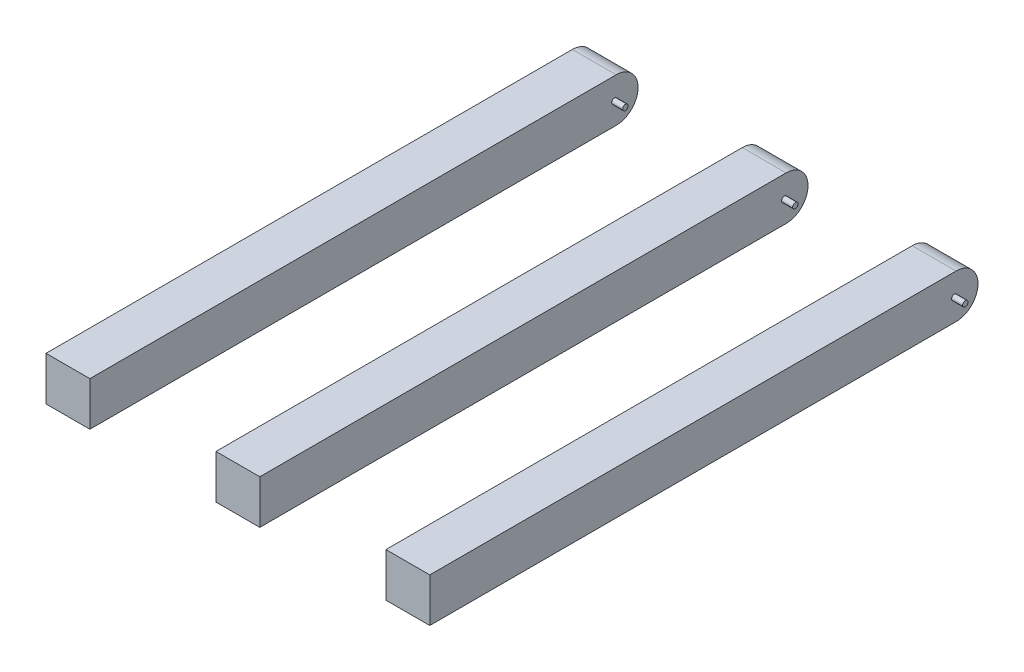
ISO-10303-21;
HEADER;
FILE_DESCRIPTION(('STEP AP214'),'2;1');
FILE_NAME('part.step','',(''),(''),'','','');
FILE_SCHEMA(('AUTOMOTIVE_DESIGN { 1 0 10303 214 1 1 1 1 }'));
ENDSEC;
DATA;
#1=APPLICATION_CONTEXT('core data for automotive mechanical design processes');
#2=APPLICATION_PROTOCOL_DEFINITION('international standard','automotive_design',2000,#1);
#3=PRODUCT_CONTEXT('',#1,'mechanical');
#4=PRODUCT('Part','Part','',(#3));
#5=PRODUCT_RELATED_PRODUCT_CATEGORY('part','',(#4));
#6=PRODUCT_DEFINITION_FORMATION('','',#4);
#7=PRODUCT_DEFINITION_CONTEXT('part definition',#1,'design');
#8=PRODUCT_DEFINITION('design','',#6,#7);
#9=PRODUCT_DEFINITION_SHAPE('','',#8);
#10=(LENGTH_UNIT() NAMED_UNIT(*) SI_UNIT(.MILLI.,.METRE.));
#11=(NAMED_UNIT(*) PLANE_ANGLE_UNIT() SI_UNIT($,.RADIAN.));
#12=(NAMED_UNIT(*) SI_UNIT($,.STERADIAN.) SOLID_ANGLE_UNIT());
#13=UNCERTAINTY_MEASURE_WITH_UNIT(LENGTH_MEASURE(1.E-05),#10,'distance_accuracy_value','');
#14=(GEOMETRIC_REPRESENTATION_CONTEXT(3) GLOBAL_UNCERTAINTY_ASSIGNED_CONTEXT((#13)) GLOBAL_UNIT_ASSIGNED_CONTEXT((#10,
#11,#12)) REPRESENTATION_CONTEXT('',''));
#15=CARTESIAN_POINT('',(0.,0.,0.));
#16=DIRECTION('',(0.,0.,1.));
#17=DIRECTION('',(1.,0.,0.));
#18=AXIS2_PLACEMENT_3D('',#15,#16,#17);
#19=CARTESIAN_POINT('',(-2.7,0.399999999999998,10.));
#20=DIRECTION('',(1.,0.,0.));
#21=DIRECTION('',(0.,1.,0.));
#22=AXIS2_PLACEMENT_3D('',#19,#20,#21);
#23=PLANE('',#22);
#24=CARTESIAN_POINT('',(-2.7,0.,0.43117289738879));
#25=DIRECTION('',(1.,0.,0.));
#26=DIRECTION('',(0.,1.,0.));
#27=AXIS2_PLACEMENT_3D('',#24,#25,#26);
#28=CIRCLE('',#27,0.0500000000000001);
#29=CARTESIAN_POINT('',(-2.7,0.0500000000000005,0.43117289738879));
#30=VERTEX_POINT('',#29);
#31=EDGE_CURVE('E124',#30,#30,#28,.T.);
#32=ORIENTED_EDGE('',*,*,#31,.F.);
#33=EDGE_LOOP('',(#32));
#34=FACE_BOUND('',#33,.T.);
#35=DIRECTION('',(0.,0.,-1.));
#36=VECTOR('',#35,1.);
#37=CARTESIAN_POINT('',(-2.7,-0.4,10.));
#38=LINE('',#37,#36);
#39=CARTESIAN_POINT('',(-2.7,-0.4,10.));
#40=VERTEX_POINT('',#39);
#41=CARTESIAN_POINT('',(-2.7,-0.4,0.399999999999999));
#42=VERTEX_POINT('',#41);
#43=EDGE_CURVE('E100',#40,#42,#38,.T.);
#44=ORIENTED_EDGE('',*,*,#43,.T.);
#45=CARTESIAN_POINT('',(-2.7,0.,0.4));
#46=DIRECTION('',(1.,0.,0.));
#47=DIRECTION('',(0.,1.,0.));
#48=AXIS2_PLACEMENT_3D('',#45,#46,#47);
#49=CIRCLE('',#48,0.4);
#50=CARTESIAN_POINT('',(-2.7,0.,0.));
#51=VERTEX_POINT('',#50);
#52=EDGE_CURVE('E65',#42,#51,#49,.T.);
#53=ORIENTED_EDGE('',*,*,#52,.T.);
#54=CARTESIAN_POINT('',(-2.7,0.,0.399999999999999));
#55=DIRECTION('',(1.,0.,0.));
#56=DIRECTION('',(0.,1.,0.));
#57=AXIS2_PLACEMENT_3D('',#54,#55,#56);
#58=CIRCLE('',#57,0.4);
#59=CARTESIAN_POINT('',(-2.7,0.399999999999998,0.399999999999999));
#60=VERTEX_POINT('',#59);
#61=EDGE_CURVE('E72',#51,#60,#58,.T.);
#62=ORIENTED_EDGE('',*,*,#61,.T.);
#63=DIRECTION('',(0.,0.,-1.));
#64=VECTOR('',#63,1.);
#65=CARTESIAN_POINT('',(-2.7,0.399999999999998,10.));
#66=LINE('',#65,#64);
#67=CARTESIAN_POINT('',(-2.7,0.399999999999998,10.));
#68=VERTEX_POINT('',#67);
#69=EDGE_CURVE('E119',#68,#60,#66,.T.);
#70=ORIENTED_EDGE('',*,*,#69,.F.);
#71=DIRECTION('',(0.,-1.,0.));
#72=VECTOR('',#71,1.);
#73=CARTESIAN_POINT('',(-2.7,0.399999999999998,10.));
#74=LINE('',#73,#72);
#75=EDGE_CURVE('E114',#68,#40,#74,.T.);
#76=ORIENTED_EDGE('',*,*,#75,.T.);
#77=EDGE_LOOP('',(#44,#53,#62,#70,#76));
#78=FACE_BOUND('',#77,.T.);
#79=ADVANCED_FACE('F56',(#34,#78),#23,.T.);
#80=CARTESIAN_POINT('',(-2.7,0.399999999999998,10.));
#81=DIRECTION('',(0.,-1.,0.));
#82=DIRECTION('',(0.,0.,-1.));
#83=AXIS2_PLACEMENT_3D('',#80,#81,#82);
#84=PLANE('',#83);
#85=ORIENTED_EDGE('',*,*,#69,.T.);
#86=DIRECTION('',(-1.,0.,0.));
#87=VECTOR('',#86,1.);
#88=CARTESIAN_POINT('',(-3.5,0.399999999999998,0.399999999999999));
#89=LINE('',#88,#87);
#90=CARTESIAN_POINT('',(-3.5,0.399999999999998,0.399999999999999));
#91=VERTEX_POINT('',#90);
#92=EDGE_CURVE('E12',#60,#91,#89,.T.);
#93=ORIENTED_EDGE('',*,*,#92,.T.);
#94=DIRECTION('',(0.,0.,-1.));
#95=VECTOR('',#94,1.);
#96=CARTESIAN_POINT('',(-3.5,0.399999999999998,10.));
#97=LINE('',#96,#95);
#98=CARTESIAN_POINT('',(-3.5,0.399999999999998,10.));
#99=VERTEX_POINT('',#98);
#100=EDGE_CURVE('E132',#99,#91,#97,.T.);
#101=ORIENTED_EDGE('',*,*,#100,.F.);
#102=DIRECTION('',(-1.,0.,0.));
#103=VECTOR('',#102,1.);
#104=CARTESIAN_POINT('',(-2.7,0.399999999999998,10.));
#105=LINE('',#104,#103);
#106=EDGE_CURVE('E109',#68,#99,#105,.T.);
#107=ORIENTED_EDGE('',*,*,#106,.F.);
#108=EDGE_LOOP('',(#85,#93,#101,#107));
#109=FACE_BOUND('',#108,.T.);
#110=ADVANCED_FACE('F156',(#109),#84,.F.);
#111=CARTESIAN_POINT('',(-3.5,0.399999999999998,10.));
#112=DIRECTION('',(1.,0.,0.));
#113=DIRECTION('',(0.,0.,-1.));
#114=AXIS2_PLACEMENT_3D('',#111,#112,#113);
#115=PLANE('',#114);
#116=CARTESIAN_POINT('',(-3.5,0.,0.399999999999999));
#117=DIRECTION('',(1.,0.,0.));
#118=DIRECTION('',(0.,0.,-1.));
#119=AXIS2_PLACEMENT_3D('',#116,#117,#118);
#120=CIRCLE('',#119,0.4);
#121=CARTESIAN_POINT('',(-3.5,0.,0.));
#122=VERTEX_POINT('',#121);
#123=EDGE_CURVE('E131',#91,#122,#120,.F.);
#124=ORIENTED_EDGE('',*,*,#123,.T.);
#125=CARTESIAN_POINT('',(-3.5,0.,0.4));
#126=DIRECTION('',(1.,0.,0.));
#127=DIRECTION('',(0.,0.,-1.));
#128=AXIS2_PLACEMENT_3D('',#125,#126,#127);
#129=CIRCLE('',#128,0.4);
#130=CARTESIAN_POINT('',(-3.5,-0.4,0.399999999999999));
#131=VERTEX_POINT('',#130);
#132=EDGE_CURVE('E137',#122,#131,#129,.F.);
#133=ORIENTED_EDGE('',*,*,#132,.T.);
#134=DIRECTION('',(0.,0.,-1.));
#135=VECTOR('',#134,1.);
#136=CARTESIAN_POINT('',(-3.5,-0.4,10.));
#137=LINE('',#136,#135);
#138=CARTESIAN_POINT('',(-3.5,-0.4,10.));
#139=VERTEX_POINT('',#138);
#140=EDGE_CURVE('E108',#139,#131,#137,.T.);
#141=ORIENTED_EDGE('',*,*,#140,.F.);
#142=DIRECTION('',(0.,-1.,0.));
#143=VECTOR('',#142,1.);
#144=CARTESIAN_POINT('',(-3.5,0.399999999999998,10.));
#145=LINE('',#144,#143);
#146=EDGE_CURVE('E116',#99,#139,#145,.T.);
#147=ORIENTED_EDGE('',*,*,#146,.F.);
#148=ORIENTED_EDGE('',*,*,#100,.T.);
#149=EDGE_LOOP('',(#124,#133,#141,#147,#148));
#150=FACE_BOUND('',#149,.T.);
#151=ADVANCED_FACE('F143',(#150),#115,.F.);
#152=CARTESIAN_POINT('',(-2.7,-0.4,10.));
#153=DIRECTION('',(0.,-1.,0.));
#154=DIRECTION('',(0.,0.,-1.));
#155=AXIS2_PLACEMENT_3D('',#152,#153,#154);
#156=PLANE('',#155);
#157=ORIENTED_EDGE('',*,*,#140,.T.);
#158=DIRECTION('',(-1.,0.,0.));
#159=VECTOR('',#158,1.);
#160=CARTESIAN_POINT('',(-2.7,-0.4,0.399999999999999));
#161=LINE('',#160,#159);
#162=EDGE_CURVE('E106',#131,#42,#161,.F.);
#163=ORIENTED_EDGE('',*,*,#162,.T.);
#164=ORIENTED_EDGE('',*,*,#43,.F.);
#165=DIRECTION('',(-1.,0.,0.));
#166=VECTOR('',#165,1.);
#167=CARTESIAN_POINT('',(-2.7,-0.4,10.));
#168=LINE('',#167,#166);
#169=EDGE_CURVE('E104',#40,#139,#168,.T.);
#170=ORIENTED_EDGE('',*,*,#169,.T.);
#171=EDGE_LOOP('',(#157,#163,#164,#170));
#172=FACE_BOUND('',#171,.T.);
#173=ADVANCED_FACE('F103',(#172),#156,.T.);
#174=CARTESIAN_POINT('',(-3.1,0.,10.));
#175=DIRECTION('',(0.,0.,-1.));
#176=DIRECTION('',(-1.,0.,0.));
#177=AXIS2_PLACEMENT_3D('',#174,#175,#176);
#178=PLANE('',#177);
#179=ORIENTED_EDGE('',*,*,#75,.F.);
#180=ORIENTED_EDGE('',*,*,#106,.T.);
#181=ORIENTED_EDGE('',*,*,#146,.T.);
#182=ORIENTED_EDGE('',*,*,#169,.F.);
#183=EDGE_LOOP('',(#179,#180,#181,#182));
#184=FACE_BOUND('',#183,.T.);
#185=ADVANCED_FACE('F113',(#184),#178,.F.);
#186=CARTESIAN_POINT('',(-2.5,0.,0.43117289738879));
#187=DIRECTION('',(-1.,0.,0.));
#188=DIRECTION('',(0.,-1.,0.));
#189=AXIS2_PLACEMENT_3D('',#186,#187,#188);
#190=CYLINDRICAL_SURFACE('',#189,0.0500000000000001);
#191=CARTESIAN_POINT('',(-2.5,0.,0.43117289738879));
#192=DIRECTION('',(1.,0.,0.));
#193=DIRECTION('',(0.,1.,0.));
#194=AXIS2_PLACEMENT_3D('',#191,#192,#193);
#195=CIRCLE('',#194,0.0500000000000001);
#196=CARTESIAN_POINT('',(-2.5,0.0500000000000007,0.43117289738879));
#197=VERTEX_POINT('',#196);
#198=EDGE_CURVE('E121',#197,#197,#195,.T.);
#199=ORIENTED_EDGE('',*,*,#198,.F.);
#200=EDGE_LOOP('',(#199));
#201=FACE_BOUND('',#200,.T.);
#202=ORIENTED_EDGE('',*,*,#31,.T.);
#203=EDGE_LOOP('',(#202));
#204=FACE_BOUND('',#203,.T.);
#205=ADVANCED_FACE('F153',(#201,#204),#190,.T.);
#206=CARTESIAN_POINT('',(-2.5,0.,0.43117289738879));
#207=DIRECTION('',(1.,0.,0.));
#208=DIRECTION('',(0.,1.,0.));
#209=AXIS2_PLACEMENT_3D('',#206,#207,#208);
#210=PLANE('',#209);
#211=ORIENTED_EDGE('',*,*,#198,.T.);
#212=EDGE_LOOP('',(#211));
#213=FACE_BOUND('',#212,.T.);
#214=ADVANCED_FACE('F169',(#213),#210,.T.);
#215=CARTESIAN_POINT('',(-2.7,0.,0.399999999999999));
#216=DIRECTION('',(1.,0.,0.));
#217=DIRECTION('',(0.,0.,-1.));
#218=AXIS2_PLACEMENT_3D('',#215,#216,#217);
#219=CYLINDRICAL_SURFACE('',#218,0.4);
#220=ORIENTED_EDGE('',*,*,#92,.F.);
#221=ORIENTED_EDGE('',*,*,#61,.F.);
#222=DIRECTION('',(-1.,0.,0.));
#223=VECTOR('',#222,1.);
#224=CARTESIAN_POINT('',(-2.7,0.,0.));
#225=LINE('',#224,#223);
#226=EDGE_CURVE('E60',#122,#51,#225,.F.);
#227=ORIENTED_EDGE('',*,*,#226,.F.);
#228=ORIENTED_EDGE('',*,*,#123,.F.);
#229=EDGE_LOOP('',(#220,#221,#227,#228));
#230=FACE_BOUND('',#229,.T.);
#231=ADVANCED_FACE('F58',(#230),#219,.T.);
#232=CARTESIAN_POINT('',(-3.1,0.,0.4));
#233=DIRECTION('',(-1.,0.,0.));
#234=DIRECTION('',(0.,0.,1.));
#235=AXIS2_PLACEMENT_3D('',#232,#233,#234);
#236=CYLINDRICAL_SURFACE('',#235,0.4);
#237=ORIENTED_EDGE('',*,*,#52,.F.);
#238=ORIENTED_EDGE('',*,*,#162,.F.);
#239=ORIENTED_EDGE('',*,*,#132,.F.);
#240=ORIENTED_EDGE('',*,*,#226,.T.);
#241=EDGE_LOOP('',(#237,#238,#239,#240));
#242=FACE_BOUND('',#241,.T.);
#243=ADVANCED_FACE('F148',(#242),#236,.T.);
#244=CLOSED_SHELL('',(#79,#110,#151,#173,#185,#205,#214,#231,#243));
#245=MANIFOLD_SOLID_BREP('B2',#244);
#246=CARTESIAN_POINT('',(3.5,0.399999999999998,10.));
#247=DIRECTION('',(1.,0.,0.));
#248=DIRECTION('',(0.,1.,0.));
#249=AXIS2_PLACEMENT_3D('',#246,#247,#248);
#250=PLANE('',#249);
#251=CARTESIAN_POINT('',(3.5,0.,0.43117289738879));
#252=DIRECTION('',(1.,0.,0.));
#253=DIRECTION('',(0.,1.,0.));
#254=AXIS2_PLACEMENT_3D('',#251,#252,#253);
#255=CIRCLE('',#254,0.0500000000000001);
#256=CARTESIAN_POINT('',(3.5,0.0500000000000005,0.43117289738879));
#257=VERTEX_POINT('',#256);
#258=EDGE_CURVE('E313',#257,#257,#255,.T.);
#259=ORIENTED_EDGE('',*,*,#258,.F.);
#260=EDGE_LOOP('',(#259));
#261=FACE_BOUND('',#260,.T.);
#262=DIRECTION('',(0.,0.,-1.));
#263=VECTOR('',#262,1.);
#264=CARTESIAN_POINT('',(3.5,-0.4,10.));
#265=LINE('',#264,#263);
#266=CARTESIAN_POINT('',(3.5,-0.4,10.));
#267=VERTEX_POINT('',#266);
#268=CARTESIAN_POINT('',(3.5,-0.4,0.399999999999999));
#269=VERTEX_POINT('',#268);
#270=EDGE_CURVE('E289',#267,#269,#265,.T.);
#271=ORIENTED_EDGE('',*,*,#270,.T.);
#272=CARTESIAN_POINT('',(3.5,0.,0.4));
#273=DIRECTION('',(1.,0.,0.));
#274=DIRECTION('',(0.,1.,0.));
#275=AXIS2_PLACEMENT_3D('',#272,#273,#274);
#276=CIRCLE('',#275,0.4);
#277=CARTESIAN_POINT('',(3.5,0.,0.));
#278=VERTEX_POINT('',#277);
#279=EDGE_CURVE('E254',#269,#278,#276,.T.);
#280=ORIENTED_EDGE('',*,*,#279,.T.);
#281=CARTESIAN_POINT('',(3.5,0.,0.399999999999999));
#282=DIRECTION('',(1.,0.,0.));
#283=DIRECTION('',(0.,1.,0.));
#284=AXIS2_PLACEMENT_3D('',#281,#282,#283);
#285=CIRCLE('',#284,0.4);
#286=CARTESIAN_POINT('',(3.5,0.399999999999998,0.399999999999999));
#287=VERTEX_POINT('',#286);
#288=EDGE_CURVE('E261',#278,#287,#285,.T.);
#289=ORIENTED_EDGE('',*,*,#288,.T.);
#290=DIRECTION('',(0.,0.,-1.));
#291=VECTOR('',#290,1.);
#292=CARTESIAN_POINT('',(3.5,0.399999999999998,10.));
#293=LINE('',#292,#291);
#294=CARTESIAN_POINT('',(3.5,0.399999999999998,10.));
#295=VERTEX_POINT('',#294);
#296=EDGE_CURVE('E308',#295,#287,#293,.T.);
#297=ORIENTED_EDGE('',*,*,#296,.F.);
#298=DIRECTION('',(0.,-1.,0.));
#299=VECTOR('',#298,1.);
#300=CARTESIAN_POINT('',(3.5,0.399999999999998,10.));
#301=LINE('',#300,#299);
#302=EDGE_CURVE('E303',#295,#267,#301,.T.);
#303=ORIENTED_EDGE('',*,*,#302,.T.);
#304=EDGE_LOOP('',(#271,#280,#289,#297,#303));
#305=FACE_BOUND('',#304,.T.);
#306=ADVANCED_FACE('F245',(#261,#305),#250,.T.);
#307=CARTESIAN_POINT('',(3.5,0.399999999999998,10.));
#308=DIRECTION('',(0.,-1.,0.));
#309=DIRECTION('',(0.,0.,-1.));
#310=AXIS2_PLACEMENT_3D('',#307,#308,#309);
#311=PLANE('',#310);
#312=ORIENTED_EDGE('',*,*,#296,.T.);
#313=DIRECTION('',(-1.,0.,0.));
#314=VECTOR('',#313,1.);
#315=CARTESIAN_POINT('',(2.7,0.399999999999998,0.399999999999999));
#316=LINE('',#315,#314);
#317=CARTESIAN_POINT('',(2.7,0.399999999999998,0.399999999999999));
#318=VERTEX_POINT('',#317);
#319=EDGE_CURVE('E54',#287,#318,#316,.T.);
#320=ORIENTED_EDGE('',*,*,#319,.T.);
#321=DIRECTION('',(0.,0.,-1.));
#322=VECTOR('',#321,1.);
#323=CARTESIAN_POINT('',(2.7,0.399999999999998,10.));
#324=LINE('',#323,#322);
#325=CARTESIAN_POINT('',(2.7,0.399999999999998,10.));
#326=VERTEX_POINT('',#325);
#327=EDGE_CURVE('E321',#326,#318,#324,.T.);
#328=ORIENTED_EDGE('',*,*,#327,.F.);
#329=DIRECTION('',(-1.,0.,0.));
#330=VECTOR('',#329,1.);
#331=CARTESIAN_POINT('',(3.5,0.399999999999998,10.));
#332=LINE('',#331,#330);
#333=EDGE_CURVE('E298',#295,#326,#332,.T.);
#334=ORIENTED_EDGE('',*,*,#333,.F.);
#335=EDGE_LOOP('',(#312,#320,#328,#334));
#336=FACE_BOUND('',#335,.T.);
#337=ADVANCED_FACE('F345',(#336),#311,.F.);
#338=CARTESIAN_POINT('',(2.7,0.399999999999998,10.));
#339=DIRECTION('',(1.,0.,0.));
#340=DIRECTION('',(0.,0.,-1.));
#341=AXIS2_PLACEMENT_3D('',#338,#339,#340);
#342=PLANE('',#341);
#343=CARTESIAN_POINT('',(2.7,0.,0.399999999999999));
#344=DIRECTION('',(1.,0.,0.));
#345=DIRECTION('',(0.,0.,-1.));
#346=AXIS2_PLACEMENT_3D('',#343,#344,#345);
#347=CIRCLE('',#346,0.4);
#348=CARTESIAN_POINT('',(2.7,0.,0.));
#349=VERTEX_POINT('',#348);
#350=EDGE_CURVE('E320',#318,#349,#347,.F.);
#351=ORIENTED_EDGE('',*,*,#350,.T.);
#352=CARTESIAN_POINT('',(2.7,0.,0.4));
#353=DIRECTION('',(1.,0.,0.));
#354=DIRECTION('',(0.,0.,-1.));
#355=AXIS2_PLACEMENT_3D('',#352,#353,#354);
#356=CIRCLE('',#355,0.4);
#357=CARTESIAN_POINT('',(2.7,-0.4,0.399999999999999));
#358=VERTEX_POINT('',#357);
#359=EDGE_CURVE('E326',#349,#358,#356,.F.);
#360=ORIENTED_EDGE('',*,*,#359,.T.);
#361=DIRECTION('',(0.,0.,-1.));
#362=VECTOR('',#361,1.);
#363=CARTESIAN_POINT('',(2.7,-0.4,10.));
#364=LINE('',#363,#362);
#365=CARTESIAN_POINT('',(2.7,-0.4,10.));
#366=VERTEX_POINT('',#365);
#367=EDGE_CURVE('E297',#366,#358,#364,.T.);
#368=ORIENTED_EDGE('',*,*,#367,.F.);
#369=DIRECTION('',(0.,-1.,0.));
#370=VECTOR('',#369,1.);
#371=CARTESIAN_POINT('',(2.7,0.399999999999998,10.));
#372=LINE('',#371,#370);
#373=EDGE_CURVE('E305',#326,#366,#372,.T.);
#374=ORIENTED_EDGE('',*,*,#373,.F.);
#375=ORIENTED_EDGE('',*,*,#327,.T.);
#376=EDGE_LOOP('',(#351,#360,#368,#374,#375));
#377=FACE_BOUND('',#376,.T.);
#378=ADVANCED_FACE('F332',(#377),#342,.F.);
#379=CARTESIAN_POINT('',(3.5,-0.4,10.));
#380=DIRECTION('',(0.,-1.,0.));
#381=DIRECTION('',(0.,0.,-1.));
#382=AXIS2_PLACEMENT_3D('',#379,#380,#381);
#383=PLANE('',#382);
#384=ORIENTED_EDGE('',*,*,#367,.T.);
#385=DIRECTION('',(-1.,0.,0.));
#386=VECTOR('',#385,1.);
#387=CARTESIAN_POINT('',(3.5,-0.4,0.399999999999999));
#388=LINE('',#387,#386);
#389=EDGE_CURVE('E295',#358,#269,#388,.F.);
#390=ORIENTED_EDGE('',*,*,#389,.T.);
#391=ORIENTED_EDGE('',*,*,#270,.F.);
#392=DIRECTION('',(-1.,0.,0.));
#393=VECTOR('',#392,1.);
#394=CARTESIAN_POINT('',(3.5,-0.4,10.));
#395=LINE('',#394,#393);
#396=EDGE_CURVE('E293',#267,#366,#395,.T.);
#397=ORIENTED_EDGE('',*,*,#396,.T.);
#398=EDGE_LOOP('',(#384,#390,#391,#397));
#399=FACE_BOUND('',#398,.T.);
#400=ADVANCED_FACE('F292',(#399),#383,.T.);
#401=CARTESIAN_POINT('',(3.1,0.,10.));
#402=DIRECTION('',(0.,0.,-1.));
#403=DIRECTION('',(-1.,0.,0.));
#404=AXIS2_PLACEMENT_3D('',#401,#402,#403);
#405=PLANE('',#404);
#406=ORIENTED_EDGE('',*,*,#302,.F.);
#407=ORIENTED_EDGE('',*,*,#333,.T.);
#408=ORIENTED_EDGE('',*,*,#373,.T.);
#409=ORIENTED_EDGE('',*,*,#396,.F.);
#410=EDGE_LOOP('',(#406,#407,#408,#409));
#411=FACE_BOUND('',#410,.T.);
#412=ADVANCED_FACE('F302',(#411),#405,.F.);
#413=CARTESIAN_POINT('',(3.7,0.,0.43117289738879));
#414=DIRECTION('',(-1.,0.,0.));
#415=DIRECTION('',(0.,-1.,0.));
#416=AXIS2_PLACEMENT_3D('',#413,#414,#415);
#417=CYLINDRICAL_SURFACE('',#416,0.0500000000000001);
#418=CARTESIAN_POINT('',(3.7,0.,0.43117289738879));
#419=DIRECTION('',(1.,0.,0.));
#420=DIRECTION('',(0.,1.,0.));
#421=AXIS2_PLACEMENT_3D('',#418,#419,#420);
#422=CIRCLE('',#421,0.0500000000000001);
#423=CARTESIAN_POINT('',(3.7,0.0500000000000007,0.43117289738879));
#424=VERTEX_POINT('',#423);
#425=EDGE_CURVE('E310',#424,#424,#422,.T.);
#426=ORIENTED_EDGE('',*,*,#425,.F.);
#427=EDGE_LOOP('',(#426));
#428=FACE_BOUND('',#427,.T.);
#429=ORIENTED_EDGE('',*,*,#258,.T.);
#430=EDGE_LOOP('',(#429));
#431=FACE_BOUND('',#430,.T.);
#432=ADVANCED_FACE('F342',(#428,#431),#417,.T.);
#433=CARTESIAN_POINT('',(3.7,0.,0.43117289738879));
#434=DIRECTION('',(1.,0.,0.));
#435=DIRECTION('',(0.,1.,0.));
#436=AXIS2_PLACEMENT_3D('',#433,#434,#435);
#437=PLANE('',#436);
#438=ORIENTED_EDGE('',*,*,#425,.T.);
#439=EDGE_LOOP('',(#438));
#440=FACE_BOUND('',#439,.T.);
#441=ADVANCED_FACE('F358',(#440),#437,.T.);
#442=CARTESIAN_POINT('',(3.5,0.,0.399999999999999));
#443=DIRECTION('',(1.,0.,0.));
#444=DIRECTION('',(0.,0.,-1.));
#445=AXIS2_PLACEMENT_3D('',#442,#443,#444);
#446=CYLINDRICAL_SURFACE('',#445,0.4);
#447=ORIENTED_EDGE('',*,*,#319,.F.);
#448=ORIENTED_EDGE('',*,*,#288,.F.);
#449=DIRECTION('',(-1.,0.,0.));
#450=VECTOR('',#449,1.);
#451=CARTESIAN_POINT('',(3.5,0.,0.));
#452=LINE('',#451,#450);
#453=EDGE_CURVE('E249',#349,#278,#452,.F.);
#454=ORIENTED_EDGE('',*,*,#453,.F.);
#455=ORIENTED_EDGE('',*,*,#350,.F.);
#456=EDGE_LOOP('',(#447,#448,#454,#455));
#457=FACE_BOUND('',#456,.T.);
#458=ADVANCED_FACE('F247',(#457),#446,.T.);
#459=CARTESIAN_POINT('',(3.1,0.,0.4));
#460=DIRECTION('',(-1.,0.,0.));
#461=DIRECTION('',(0.,0.,1.));
#462=AXIS2_PLACEMENT_3D('',#459,#460,#461);
#463=CYLINDRICAL_SURFACE('',#462,0.4);
#464=ORIENTED_EDGE('',*,*,#279,.F.);
#465=ORIENTED_EDGE('',*,*,#389,.F.);
#466=ORIENTED_EDGE('',*,*,#359,.F.);
#467=ORIENTED_EDGE('',*,*,#453,.T.);
#468=EDGE_LOOP('',(#464,#465,#466,#467));
#469=FACE_BOUND('',#468,.T.);
#470=ADVANCED_FACE('F337',(#469),#463,.T.);
#471=CLOSED_SHELL('',(#306,#337,#378,#400,#412,#432,#441,#458,#470));
#472=MANIFOLD_SOLID_BREP('B6',#471);
#473=CARTESIAN_POINT('',(0.399999999999998,0.399999999999998,10.));
#474=DIRECTION('',(1.,0.,0.));
#475=DIRECTION('',(0.,1.,0.));
#476=AXIS2_PLACEMENT_3D('',#473,#474,#475);
#477=PLANE('',#476);
#478=CARTESIAN_POINT('',(0.399999999999999,0.,0.43117289738879));
#479=DIRECTION('',(1.,0.,0.));
#480=DIRECTION('',(0.,1.,0.));
#481=AXIS2_PLACEMENT_3D('',#478,#479,#480);
#482=CIRCLE('',#481,0.0500000000000001);
#483=CARTESIAN_POINT('',(0.399999999999999,0.0500000000000005,0.43117289738879));
#484=VERTEX_POINT('',#483);
#485=EDGE_CURVE('E498',#484,#484,#482,.T.);
#486=ORIENTED_EDGE('',*,*,#485,.F.);
#487=EDGE_LOOP('',(#486));
#488=FACE_BOUND('',#487,.T.);
#489=DIRECTION('',(0.,0.,-1.));
#490=VECTOR('',#489,1.);
#491=CARTESIAN_POINT('',(0.399999999999999,-0.4,10.));
#492=LINE('',#491,#490);
#493=CARTESIAN_POINT('',(0.399999999999999,-0.4,10.));
#494=VERTEX_POINT('',#493);
#495=CARTESIAN_POINT('',(0.399999999999999,-0.4,0.399999999999999));
#496=VERTEX_POINT('',#495);
#497=EDGE_CURVE('E470',#494,#496,#492,.T.);
#498=ORIENTED_EDGE('',*,*,#497,.T.);
#499=CARTESIAN_POINT('',(0.399999999999999,0.,0.4));
#500=DIRECTION('',(1.,0.,0.));
#501=DIRECTION('',(0.,1.,0.));
#502=AXIS2_PLACEMENT_3D('',#499,#500,#501);
#503=CIRCLE('',#502,0.4);
#504=CARTESIAN_POINT('',(0.399999999999999,0.,0.));
#505=VERTEX_POINT('',#504);
#506=EDGE_CURVE('E435',#496,#505,#503,.T.);
#507=ORIENTED_EDGE('',*,*,#506,.T.);
#508=CARTESIAN_POINT('',(0.399999999999999,0.,0.399999999999999));
#509=DIRECTION('',(1.,0.,0.));
#510=DIRECTION('',(0.,1.,0.));
#511=AXIS2_PLACEMENT_3D('',#508,#509,#510);
#512=CIRCLE('',#511,0.4);
#513=CARTESIAN_POINT('',(0.399999999999998,0.399999999999998,0.399999999999999));
#514=VERTEX_POINT('',#513);
#515=EDGE_CURVE('E442',#505,#514,#512,.T.);
#516=ORIENTED_EDGE('',*,*,#515,.T.);
#517=DIRECTION('',(0.,0.,-1.));
#518=VECTOR('',#517,1.);
#519=CARTESIAN_POINT('',(0.399999999999998,0.399999999999998,10.));
#520=LINE('',#519,#518);
#521=CARTESIAN_POINT('',(0.399999999999998,0.399999999999998,10.));
#522=VERTEX_POINT('',#521);
#523=EDGE_CURVE('E491',#522,#514,#520,.T.);
#524=ORIENTED_EDGE('',*,*,#523,.F.);
#525=DIRECTION('',(0.,-1.,0.));
#526=VECTOR('',#525,1.);
#527=CARTESIAN_POINT('',(0.399999999999998,0.399999999999998,10.));
#528=LINE('',#527,#526);
#529=EDGE_CURVE('E485',#522,#494,#528,.T.);
#530=ORIENTED_EDGE('',*,*,#529,.T.);
#531=EDGE_LOOP('',(#498,#507,#516,#524,#530));
#532=FACE_BOUND('',#531,.T.);
#533=ADVANCED_FACE('F425',(#488,#532),#477,.T.);
#534=CARTESIAN_POINT('',(0.399999999999998,0.399999999999998,10.));
#535=DIRECTION('',(0.,-1.,0.));
#536=DIRECTION('',(0.,0.,-1.));
#537=AXIS2_PLACEMENT_3D('',#534,#535,#536);
#538=PLANE('',#537);
#539=ORIENTED_EDGE('',*,*,#523,.T.);
#540=DIRECTION('',(-1.,0.,0.));
#541=VECTOR('',#540,1.);
#542=CARTESIAN_POINT('',(-0.400000000000002,0.399999999999998,0.399999999999999));
#543=LINE('',#542,#541);
#544=CARTESIAN_POINT('',(-0.400000000000002,0.399999999999998,0.399999999999999));
#545=VERTEX_POINT('',#544);
#546=EDGE_CURVE('E243',#514,#545,#543,.T.);
#547=ORIENTED_EDGE('',*,*,#546,.T.);
#548=DIRECTION('',(0.,0.,-1.));
#549=VECTOR('',#548,1.);
#550=CARTESIAN_POINT('',(-0.400000000000002,0.399999999999998,10.));
#551=LINE('',#550,#549);
#552=CARTESIAN_POINT('',(-0.400000000000002,0.399999999999998,10.));
#553=VERTEX_POINT('',#552);
#554=EDGE_CURVE('E509',#553,#545,#551,.T.);
#555=ORIENTED_EDGE('',*,*,#554,.F.);
#556=DIRECTION('',(-1.,0.,0.));
#557=VECTOR('',#556,1.);
#558=CARTESIAN_POINT('',(0.399999999999998,0.399999999999998,10.));
#559=LINE('',#558,#557);
#560=EDGE_CURVE('E480',#522,#553,#559,.T.);
#561=ORIENTED_EDGE('',*,*,#560,.F.);
#562=EDGE_LOOP('',(#539,#547,#555,#561));
#563=FACE_BOUND('',#562,.T.);
#564=ADVANCED_FACE('F542',(#563),#538,.F.);
#565=CARTESIAN_POINT('',(-0.400000000000002,0.399999999999998,10.));
#566=DIRECTION('',(1.,0.,0.));
#567=DIRECTION('',(0.,0.,-1.));
#568=AXIS2_PLACEMENT_3D('',#565,#566,#567);
#569=PLANE('',#568);
#570=CARTESIAN_POINT('',(-0.400000000000002,0.,0.399999999999999));
#571=DIRECTION('',(1.,0.,0.));
#572=DIRECTION('',(0.,0.,-1.));
#573=AXIS2_PLACEMENT_3D('',#570,#571,#572);
#574=CIRCLE('',#573,0.4);
#575=CARTESIAN_POINT('',(-0.400000000000002,0.,0.));
#576=VERTEX_POINT('',#575);
#577=EDGE_CURVE('E508',#545,#576,#574,.F.);
#578=ORIENTED_EDGE('',*,*,#577,.T.);
#579=CARTESIAN_POINT('',(-0.400000000000002,0.,0.4));
#580=DIRECTION('',(1.,0.,0.));
#581=DIRECTION('',(0.,0.,-1.));
#582=AXIS2_PLACEMENT_3D('',#579,#580,#581);
#583=CIRCLE('',#582,0.4);
#584=CARTESIAN_POINT('',(-0.400000000000002,-0.4,0.399999999999999));
#585=VERTEX_POINT('',#584);
#586=EDGE_CURVE('E517',#576,#585,#583,.F.);
#587=ORIENTED_EDGE('',*,*,#586,.T.);
#588=DIRECTION('',(0.,0.,-1.));
#589=VECTOR('',#588,1.);
#590=CARTESIAN_POINT('',(-0.400000000000002,-0.4,10.));
#591=LINE('',#590,#589);
#592=CARTESIAN_POINT('',(-0.400000000000002,-0.4,10.));
#593=VERTEX_POINT('',#592);
#594=EDGE_CURVE('E479',#593,#585,#591,.T.);
#595=ORIENTED_EDGE('',*,*,#594,.F.);
#596=DIRECTION('',(0.,-1.,0.));
#597=VECTOR('',#596,1.);
#598=CARTESIAN_POINT('',(-0.400000000000002,0.399999999999998,10.));
#599=LINE('',#598,#597);
#600=EDGE_CURVE('E487',#553,#593,#599,.T.);
#601=ORIENTED_EDGE('',*,*,#600,.F.);
#602=ORIENTED_EDGE('',*,*,#554,.T.);
#603=EDGE_LOOP('',(#578,#587,#595,#601,#602));
#604=FACE_BOUND('',#603,.T.);
#605=ADVANCED_FACE('F527',(#604),#569,.F.);
#606=CARTESIAN_POINT('',(0.399999999999999,-0.4,10.));
#607=DIRECTION('',(0.,-1.,0.));
#608=DIRECTION('',(0.,0.,-1.));
#609=AXIS2_PLACEMENT_3D('',#606,#607,#608);
#610=PLANE('',#609);
#611=ORIENTED_EDGE('',*,*,#594,.T.);
#612=DIRECTION('',(-1.,0.,0.));
#613=VECTOR('',#612,1.);
#614=CARTESIAN_POINT('',(0.399999999999999,-0.4,0.399999999999999));
#615=LINE('',#614,#613);
#616=EDGE_CURVE('E476',#585,#496,#615,.F.);
#617=ORIENTED_EDGE('',*,*,#616,.T.);
#618=ORIENTED_EDGE('',*,*,#497,.F.);
#619=DIRECTION('',(-1.,0.,0.));
#620=VECTOR('',#619,1.);
#621=CARTESIAN_POINT('',(0.399999999999999,-0.4,10.));
#622=LINE('',#621,#620);
#623=EDGE_CURVE('E474',#494,#593,#622,.T.);
#624=ORIENTED_EDGE('',*,*,#623,.T.);
#625=EDGE_LOOP('',(#611,#617,#618,#624));
#626=FACE_BOUND('',#625,.T.);
#627=ADVANCED_FACE('F473',(#626),#610,.T.);
#628=CARTESIAN_POINT('',(0.,0.,10.));
#629=DIRECTION('',(0.,0.,-1.));
#630=DIRECTION('',(-1.,0.,0.));
#631=AXIS2_PLACEMENT_3D('',#628,#629,#630);
#632=PLANE('',#631);
#633=ORIENTED_EDGE('',*,*,#529,.F.);
#634=ORIENTED_EDGE('',*,*,#560,.T.);
#635=ORIENTED_EDGE('',*,*,#600,.T.);
#636=ORIENTED_EDGE('',*,*,#623,.F.);
#637=EDGE_LOOP('',(#633,#634,#635,#636));
#638=FACE_BOUND('',#637,.T.);
#639=ADVANCED_FACE('F484',(#638),#632,.F.);
#640=CARTESIAN_POINT('',(0.599999999999999,0.,0.43117289738879));
#641=DIRECTION('',(-1.,0.,0.));
#642=DIRECTION('',(0.,-1.,0.));
#643=AXIS2_PLACEMENT_3D('',#640,#641,#642);
#644=CYLINDRICAL_SURFACE('',#643,0.0500000000000001);
#645=CARTESIAN_POINT('',(0.599999999999999,0.,0.43117289738879));
#646=DIRECTION('',(1.,0.,0.));
#647=DIRECTION('',(0.,1.,0.));
#648=AXIS2_PLACEMENT_3D('',#645,#646,#647);
#649=CIRCLE('',#648,0.0500000000000001);
#650=CARTESIAN_POINT('',(0.599999999999999,0.0500000000000007,0.43117289738879));
#651=VERTEX_POINT('',#650);
#652=EDGE_CURVE('E494',#651,#651,#649,.T.);
#653=ORIENTED_EDGE('',*,*,#652,.F.);
#654=EDGE_LOOP('',(#653));
#655=FACE_BOUND('',#654,.T.);
#656=ORIENTED_EDGE('',*,*,#485,.T.);
#657=EDGE_LOOP('',(#656));
#658=FACE_BOUND('',#657,.T.);
#659=ADVANCED_FACE('F539',(#655,#658),#644,.T.);
#660=CARTESIAN_POINT('',(0.599999999999999,0.,0.43117289738879));
#661=DIRECTION('',(1.,0.,0.));
#662=DIRECTION('',(0.,1.,0.));
#663=AXIS2_PLACEMENT_3D('',#660,#661,#662);
#664=PLANE('',#663);
#665=ORIENTED_EDGE('',*,*,#652,.T.);
#666=EDGE_LOOP('',(#665));
#667=FACE_BOUND('',#666,.T.);
#668=ADVANCED_FACE('F556',(#667),#664,.T.);
#669=CARTESIAN_POINT('',(0.399999999999998,0.,0.399999999999999));
#670=DIRECTION('',(1.,0.,0.));
#671=DIRECTION('',(0.,0.,-1.));
#672=AXIS2_PLACEMENT_3D('',#669,#670,#671);
#673=CYLINDRICAL_SURFACE('',#672,0.4);
#674=ORIENTED_EDGE('',*,*,#546,.F.);
#675=ORIENTED_EDGE('',*,*,#515,.F.);
#676=DIRECTION('',(-1.,0.,0.));
#677=VECTOR('',#676,1.);
#678=CARTESIAN_POINT('',(0.399999999999998,0.,0.));
#679=LINE('',#678,#677);
#680=EDGE_CURVE('E429',#576,#505,#679,.F.);
#681=ORIENTED_EDGE('',*,*,#680,.F.);
#682=ORIENTED_EDGE('',*,*,#577,.F.);
#683=EDGE_LOOP('',(#674,#675,#681,#682));
#684=FACE_BOUND('',#683,.T.);
#685=ADVANCED_FACE('F427',(#684),#673,.T.);
#686=CARTESIAN_POINT('',(0.,0.,0.4));
#687=DIRECTION('',(-1.,0.,0.));
#688=DIRECTION('',(0.,0.,1.));
#689=AXIS2_PLACEMENT_3D('',#686,#687,#688);
#690=CYLINDRICAL_SURFACE('',#689,0.4);
#691=ORIENTED_EDGE('',*,*,#506,.F.);
#692=ORIENTED_EDGE('',*,*,#616,.F.);
#693=ORIENTED_EDGE('',*,*,#586,.F.);
#694=ORIENTED_EDGE('',*,*,#680,.T.);
#695=EDGE_LOOP('',(#691,#692,#693,#694));
#696=FACE_BOUND('',#695,.T.);
#697=ADVANCED_FACE('F532',(#696),#690,.T.);
#698=CLOSED_SHELL('',(#533,#564,#605,#627,#639,#659,#668,#685,#697));
#699=MANIFOLD_SOLID_BREP('B48',#698);
#700=ADVANCED_BREP_SHAPE_REPRESENTATION('',(#18,#245,#472,#699),#14);
#701=SHAPE_DEFINITION_REPRESENTATION(#9,#700);
ENDSEC;
END-ISO-10303-21;
